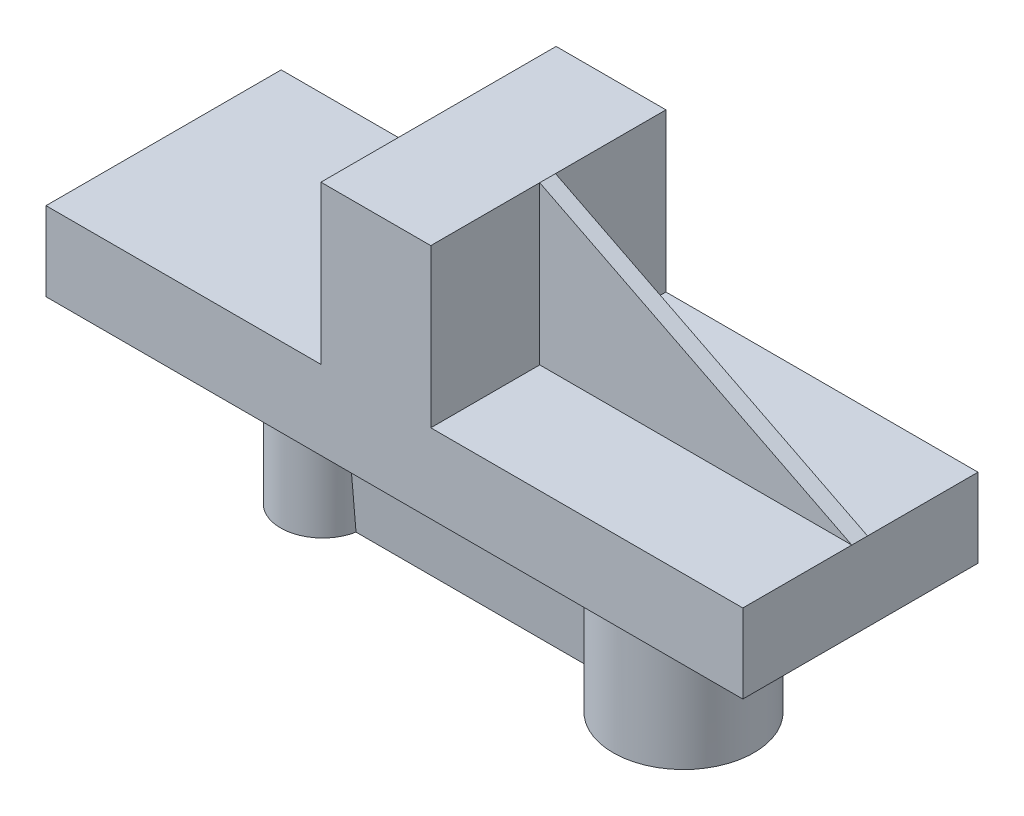
ISO-10303-21;
HEADER;
FILE_DESCRIPTION(('STEP AP214'),'2;1');
FILE_NAME('part.step','',(''),(''),'','','');
FILE_SCHEMA(('AUTOMOTIVE_DESIGN { 1 0 10303 214 1 1 1 1 }'));
ENDSEC;
DATA;
#1=APPLICATION_CONTEXT('core data for automotive mechanical design processes');
#2=APPLICATION_PROTOCOL_DEFINITION('international standard','automotive_design',2000,#1);
#3=PRODUCT_CONTEXT('',#1,'mechanical');
#4=PRODUCT('Part','Part','',(#3));
#5=PRODUCT_RELATED_PRODUCT_CATEGORY('part','',(#4));
#6=PRODUCT_DEFINITION_FORMATION('','',#4);
#7=PRODUCT_DEFINITION_CONTEXT('part definition',#1,'design');
#8=PRODUCT_DEFINITION('design','',#6,#7);
#9=PRODUCT_DEFINITION_SHAPE('','',#8);
#10=(LENGTH_UNIT() NAMED_UNIT(*) SI_UNIT(.MILLI.,.METRE.));
#11=(NAMED_UNIT(*) PLANE_ANGLE_UNIT() SI_UNIT($,.RADIAN.));
#12=(NAMED_UNIT(*) SI_UNIT($,.STERADIAN.) SOLID_ANGLE_UNIT());
#13=UNCERTAINTY_MEASURE_WITH_UNIT(LENGTH_MEASURE(1.E-05),#10,'distance_accuracy_value','');
#14=(GEOMETRIC_REPRESENTATION_CONTEXT(3) GLOBAL_UNCERTAINTY_ASSIGNED_CONTEXT((#13)) GLOBAL_UNIT_ASSIGNED_CONTEXT((#10,
#11,#12)) REPRESENTATION_CONTEXT('',''));
#15=CARTESIAN_POINT('',(0.,0.,0.));
#16=DIRECTION('',(0.,0.,1.));
#17=DIRECTION('',(1.,0.,0.));
#18=AXIS2_PLACEMENT_3D('',#15,#16,#17);
#19=CARTESIAN_POINT('',(0.,10.,0.));
#20=DIRECTION('',(0.,1.,0.));
#21=DIRECTION('',(0.,0.,1.));
#22=AXIS2_PLACEMENT_3D('',#19,#20,#21);
#23=PLANE('',#22);
#24=DIRECTION('',(0.,0.,-1.));
#25=VECTOR('',#24,1.);
#26=CARTESIAN_POINT('',(88.3232628691615,10.,0.));
#27=LINE('',#26,#25);
#28=CARTESIAN_POINT('',(88.3232628691615,10.,14.));
#29=VERTEX_POINT('',#28);
#30=CARTESIAN_POINT('',(88.3232628691615,10.,0.));
#31=VERTEX_POINT('',#30);
#32=EDGE_CURVE('E225',#29,#31,#27,.T.);
#33=ORIENTED_EDGE('',*,*,#32,.T.);
#34=DIRECTION('',(-1.,0.,0.));
#35=VECTOR('',#34,1.);
#36=CARTESIAN_POINT('',(0.,10.,0.));
#37=LINE('',#36,#35);
#38=CARTESIAN_POINT('',(48.7716091547332,10.,0.));
#39=VERTEX_POINT('',#38);
#40=EDGE_CURVE('E229',#31,#39,#37,.T.);
#41=ORIENTED_EDGE('',*,*,#40,.T.);
#42=DIRECTION('',(0.,0.,-1.));
#43=VECTOR('',#42,1.);
#44=CARTESIAN_POINT('',(48.7716091547332,10.,0.));
#45=LINE('',#44,#43);
#46=CARTESIAN_POINT('',(48.7716091547332,10.,14.));
#47=VERTEX_POINT('',#46);
#48=EDGE_CURVE('E204',#47,#39,#45,.T.);
#49=ORIENTED_EDGE('',*,*,#48,.F.);
#50=DIRECTION('',(1.,0.,0.));
#51=VECTOR('',#50,1.);
#52=CARTESIAN_POINT('',(0.,10.,14.));
#53=LINE('',#52,#51);
#54=EDGE_CURVE('E179',#47,#29,#53,.T.);
#55=ORIENTED_EDGE('',*,*,#54,.T.);
#56=EDGE_LOOP('',(#33,#41,#49,#55));
#57=FACE_BOUND('',#56,.T.);
#58=ADVANCED_FACE('F33',(#57),#23,.T.);
#59=CARTESIAN_POINT('',(48.7716091547332,30.,0.));
#60=DIRECTION('',(-1.,0.,0.));
#61=DIRECTION('',(0.,0.,1.));
#62=AXIS2_PLACEMENT_3D('',#59,#60,#61);
#63=PLANE('',#62);
#64=ORIENTED_EDGE('',*,*,#48,.T.);
#65=DIRECTION('',(0.,-1.,0.));
#66=VECTOR('',#65,1.);
#67=CARTESIAN_POINT('',(48.7716091547332,30.,0.));
#68=LINE('',#67,#66);
#69=CARTESIAN_POINT('',(48.7716091547332,30.,0.));
#70=VERTEX_POINT('',#69);
#71=EDGE_CURVE('E208',#70,#39,#68,.T.);
#72=ORIENTED_EDGE('',*,*,#71,.F.);
#73=DIRECTION('',(0.,0.,-1.));
#74=VECTOR('',#73,1.);
#75=CARTESIAN_POINT('',(48.7716091547332,30.,0.));
#76=LINE('',#75,#74);
#77=CARTESIAN_POINT('',(48.7716091547332,30.,14.));
#78=VERTEX_POINT('',#77);
#79=EDGE_CURVE('E196',#78,#70,#76,.T.);
#80=ORIENTED_EDGE('',*,*,#79,.F.);
#81=DIRECTION('',(0.,1.,0.));
#82=VECTOR('',#81,1.);
#83=CARTESIAN_POINT('',(48.7716091547332,30.,14.));
#84=LINE('',#83,#82);
#85=EDGE_CURVE('E176',#47,#78,#84,.T.);
#86=ORIENTED_EDGE('',*,*,#85,.F.);
#87=EDGE_LOOP('',(#64,#72,#80,#86));
#88=FACE_BOUND('',#87,.T.);
#89=ADVANCED_FACE('F284',(#88),#63,.F.);
#90=DIRECTION('',(1.,0.,0.));
#91=VECTOR('',#90,1.);
#92=CARTESIAN_POINT('',(0.,10.,29.809101218342));
#93=LINE('',#92,#91);
#94=CARTESIAN_POINT('',(0.,10.,29.809101218342));
#95=VERTEX_POINT('',#94);
#96=CARTESIAN_POINT('',(34.8475948163136,10.,29.809101218342));
#97=VERTEX_POINT('',#96);
#98=EDGE_CURVE('E222',#95,#97,#93,.T.);
#99=ORIENTED_EDGE('',*,*,#98,.T.);
#100=DIRECTION('',(0.,0.,1.));
#101=VECTOR('',#100,1.);
#102=CARTESIAN_POINT('',(34.8475948163136,10.,0.));
#103=LINE('',#102,#101);
#104=CARTESIAN_POINT('',(34.8475948163136,10.,0.));
#105=VERTEX_POINT('',#104);
#106=EDGE_CURVE('E190',#105,#97,#103,.T.);
#107=ORIENTED_EDGE('',*,*,#106,.F.);
#108=CARTESIAN_POINT('',(0.,10.,0.));
#109=VERTEX_POINT('',#108);
#110=EDGE_CURVE('E228',#105,#109,#37,.T.);
#111=ORIENTED_EDGE('',*,*,#110,.T.);
#112=DIRECTION('',(0.,0.,1.));
#113=VECTOR('',#112,1.);
#114=CARTESIAN_POINT('',(0.,10.,0.));
#115=LINE('',#114,#113);
#116=EDGE_CURVE('E218',#109,#95,#115,.T.);
#117=ORIENTED_EDGE('',*,*,#116,.T.);
#118=EDGE_LOOP('',(#99,#107,#111,#117));
#119=FACE_BOUND('',#118,.T.);
#120=ADVANCED_FACE('F306',(#119),#23,.T.);
#121=CARTESIAN_POINT('',(0.,10.,0.));
#122=DIRECTION('',(1.,0.,0.));
#123=DIRECTION('',(0.,0.,-1.));
#124=AXIS2_PLACEMENT_3D('',#121,#122,#123);
#125=PLANE('',#124);
#126=DIRECTION('',(0.,-1.,0.));
#127=VECTOR('',#126,1.);
#128=CARTESIAN_POINT('',(0.,10.,29.809101218342));
#129=LINE('',#128,#127);
#130=CARTESIAN_POINT('',(0.,0.,29.809101218342));
#131=VERTEX_POINT('',#130);
#132=EDGE_CURVE('E247',#95,#131,#129,.T.);
#133=ORIENTED_EDGE('',*,*,#132,.F.);
#134=ORIENTED_EDGE('',*,*,#116,.F.);
#135=DIRECTION('',(0.,-1.,0.));
#136=VECTOR('',#135,1.);
#137=CARTESIAN_POINT('',(0.,10.,0.));
#138=LINE('',#137,#136);
#139=CARTESIAN_POINT('',(0.,0.,0.));
#140=VERTEX_POINT('',#139);
#141=EDGE_CURVE('E232',#109,#140,#138,.T.);
#142=ORIENTED_EDGE('',*,*,#141,.T.);
#143=DIRECTION('',(0.,0.,1.));
#144=VECTOR('',#143,1.);
#145=CARTESIAN_POINT('',(0.,0.,0.));
#146=LINE('',#145,#144);
#147=EDGE_CURVE('E217',#140,#131,#146,.T.);
#148=ORIENTED_EDGE('',*,*,#147,.T.);
#149=EDGE_LOOP('',(#133,#134,#142,#148));
#150=FACE_BOUND('',#149,.T.);
#151=ADVANCED_FACE('F35',(#150),#125,.F.);
#152=CARTESIAN_POINT('',(0.,10.,29.809101218342));
#153=DIRECTION('',(0.,0.,-1.));
#154=DIRECTION('',(-1.,0.,0.));
#155=AXIS2_PLACEMENT_3D('',#152,#153,#154);
#156=PLANE('',#155);
#157=DIRECTION('',(1.,0.,0.));
#158=VECTOR('',#157,1.);
#159=CARTESIAN_POINT('',(0.,0.,29.809101218342));
#160=LINE('',#159,#158);
#161=CARTESIAN_POINT('',(88.3232628691615,0.,29.809101218342));
#162=VERTEX_POINT('',#161);
#163=EDGE_CURVE('E234',#131,#162,#160,.T.);
#164=ORIENTED_EDGE('',*,*,#163,.T.);
#165=DIRECTION('',(0.,-1.,0.));
#166=VECTOR('',#165,1.);
#167=CARTESIAN_POINT('',(88.3232628691615,10.,29.809101218342));
#168=LINE('',#167,#166);
#169=CARTESIAN_POINT('',(88.3232628691615,10.,29.809101218342));
#170=VERTEX_POINT('',#169);
#171=EDGE_CURVE('E244',#170,#162,#168,.T.);
#172=ORIENTED_EDGE('',*,*,#171,.F.);
#173=CARTESIAN_POINT('',(48.7716091547332,10.,29.809101218342));
#174=VERTEX_POINT('',#173);
#175=EDGE_CURVE('E220',#174,#170,#93,.T.);
#176=ORIENTED_EDGE('',*,*,#175,.F.);
#177=DIRECTION('',(0.,-1.,0.));
#178=VECTOR('',#177,1.);
#179=CARTESIAN_POINT('',(48.7716091547332,30.,29.809101218342));
#180=LINE('',#179,#178);
#181=CARTESIAN_POINT('',(48.7716091547332,30.,29.809101218342));
#182=VERTEX_POINT('',#181);
#183=EDGE_CURVE('E211',#182,#174,#180,.T.);
#184=ORIENTED_EDGE('',*,*,#183,.F.);
#185=DIRECTION('',(1.,0.,0.));
#186=VECTOR('',#185,1.);
#187=CARTESIAN_POINT('',(34.8475948163136,30.,29.809101218342));
#188=LINE('',#187,#186);
#189=CARTESIAN_POINT('',(34.8475948163136,30.,29.809101218342));
#190=VERTEX_POINT('',#189);
#191=EDGE_CURVE('E193',#190,#182,#188,.T.);
#192=ORIENTED_EDGE('',*,*,#191,.F.);
#193=DIRECTION('',(0.,-1.,0.));
#194=VECTOR('',#193,1.);
#195=CARTESIAN_POINT('',(34.8475948163136,30.,29.809101218342));
#196=LINE('',#195,#194);
#197=EDGE_CURVE('E214',#190,#97,#196,.T.);
#198=ORIENTED_EDGE('',*,*,#197,.T.);
#199=ORIENTED_EDGE('',*,*,#98,.F.);
#200=ORIENTED_EDGE('',*,*,#132,.T.);
#201=EDGE_LOOP('',(#164,#172,#176,#184,#192,#198,#199,#200));
#202=FACE_BOUND('',#201,.T.);
#203=ADVANCED_FACE('F252',(#202),#156,.F.);
#204=CARTESIAN_POINT('',(88.3232628691615,10.,0.));
#205=DIRECTION('',(-1.,0.,0.));
#206=DIRECTION('',(0.,0.,1.));
#207=AXIS2_PLACEMENT_3D('',#204,#205,#206);
#208=PLANE('',#207);
#209=DIRECTION('',(0.,0.,-1.));
#210=VECTOR('',#209,1.);
#211=CARTESIAN_POINT('',(88.3232628691615,0.,0.));
#212=LINE('',#211,#210);
#213=CARTESIAN_POINT('',(88.3232628691615,0.,0.));
#214=VERTEX_POINT('',#213);
#215=EDGE_CURVE('E236',#162,#214,#212,.T.);
#216=ORIENTED_EDGE('',*,*,#215,.T.);
#217=DIRECTION('',(0.,-1.,0.));
#218=VECTOR('',#217,1.);
#219=CARTESIAN_POINT('',(88.3232628691615,10.,0.));
#220=LINE('',#219,#218);
#221=EDGE_CURVE('E241',#31,#214,#220,.T.);
#222=ORIENTED_EDGE('',*,*,#221,.F.);
#223=ORIENTED_EDGE('',*,*,#32,.F.);
#224=DIRECTION('',(0.,0.,1.));
#225=VECTOR('',#224,1.);
#226=CARTESIAN_POINT('',(88.3232628691615,10.,0.));
#227=LINE('',#226,#225);
#228=CARTESIAN_POINT('',(88.3232628691615,10.,16.));
#229=VERTEX_POINT('',#228);
#230=EDGE_CURVE('E188',#229,#29,#227,.F.);
#231=ORIENTED_EDGE('',*,*,#230,.F.);
#232=EDGE_CURVE('E226',#170,#229,#27,.T.);
#233=ORIENTED_EDGE('',*,*,#232,.F.);
#234=ORIENTED_EDGE('',*,*,#171,.T.);
#235=EDGE_LOOP('',(#216,#222,#223,#231,#233,#234));
#236=FACE_BOUND('',#235,.T.);
#237=ADVANCED_FACE('F265',(#236),#208,.F.);
#238=CARTESIAN_POINT('',(0.,10.,0.));
#239=DIRECTION('',(0.,0.,1.));
#240=DIRECTION('',(1.,0.,0.));
#241=AXIS2_PLACEMENT_3D('',#238,#239,#240);
#242=PLANE('',#241);
#243=DIRECTION('',(-1.,0.,0.));
#244=VECTOR('',#243,1.);
#245=CARTESIAN_POINT('',(0.,0.,0.));
#246=LINE('',#245,#244);
#247=EDGE_CURVE('E221',#214,#140,#246,.T.);
#248=ORIENTED_EDGE('',*,*,#247,.T.);
#249=ORIENTED_EDGE('',*,*,#141,.F.);
#250=ORIENTED_EDGE('',*,*,#110,.F.);
#251=DIRECTION('',(0.,-1.,0.));
#252=VECTOR('',#251,1.);
#253=CARTESIAN_POINT('',(34.8475948163136,30.,0.));
#254=LINE('',#253,#252);
#255=CARTESIAN_POINT('',(34.8475948163136,30.,0.));
#256=VERTEX_POINT('',#255);
#257=EDGE_CURVE('E202',#256,#105,#254,.T.);
#258=ORIENTED_EDGE('',*,*,#257,.F.);
#259=DIRECTION('',(-1.,0.,0.));
#260=VECTOR('',#259,1.);
#261=CARTESIAN_POINT('',(34.8475948163136,30.,0.));
#262=LINE('',#261,#260);
#263=EDGE_CURVE('E199',#70,#256,#262,.T.);
#264=ORIENTED_EDGE('',*,*,#263,.F.);
#265=ORIENTED_EDGE('',*,*,#71,.T.);
#266=ORIENTED_EDGE('',*,*,#40,.F.);
#267=ORIENTED_EDGE('',*,*,#221,.T.);
#268=EDGE_LOOP('',(#248,#249,#250,#258,#264,#265,#266,#267));
#269=FACE_BOUND('',#268,.T.);
#270=ADVANCED_FACE('F270',(#269),#242,.F.);
#271=ORIENTED_EDGE('',*,*,#232,.T.);
#272=DIRECTION('',(1.,0.,0.));
#273=VECTOR('',#272,1.);
#274=CARTESIAN_POINT('',(0.,10.,16.));
#275=LINE('',#274,#273);
#276=CARTESIAN_POINT('',(48.7716091547332,10.,16.));
#277=VERTEX_POINT('',#276);
#278=EDGE_CURVE('E185',#277,#229,#275,.T.);
#279=ORIENTED_EDGE('',*,*,#278,.F.);
#280=EDGE_CURVE('E194',#174,#277,#45,.T.);
#281=ORIENTED_EDGE('',*,*,#280,.F.);
#282=ORIENTED_EDGE('',*,*,#175,.T.);
#283=EDGE_LOOP('',(#271,#279,#281,#282));
#284=FACE_BOUND('',#283,.T.);
#285=ADVANCED_FACE('F297',(#284),#23,.T.);
#286=CARTESIAN_POINT('',(0.,0.,0.));
#287=DIRECTION('',(0.,1.,0.));
#288=DIRECTION('',(0.,0.,1.));
#289=AXIS2_PLACEMENT_3D('',#286,#287,#288);
#290=PLANE('',#289);
#291=CARTESIAN_POINT('',(20.2556041143617,0.,15.));
#292=DIRECTION('',(0.,1.,0.));
#293=DIRECTION('',(0.,0.,1.));
#294=AXIS2_PLACEMENT_3D('',#291,#292,#293);
#295=CIRCLE('',#294,5.32677589371184);
#296=CARTESIAN_POINT('',(25.0118174540529,0.,17.3985362388702));
#297=VERTEX_POINT('',#296);
#298=CARTESIAN_POINT('',(25.0118174540529,0.,12.6014637611298));
#299=VERTEX_POINT('',#298);
#300=EDGE_CURVE('E41',#297,#299,#295,.F.);
#301=ORIENTED_EDGE('',*,*,#300,.F.);
#302=DIRECTION('',(1.,0.,0.));
#303=VECTOR('',#302,1.);
#304=CARTESIAN_POINT('',(0.,0.,17.3985362388702));
#305=LINE('',#304,#303);
#306=CARTESIAN_POINT('',(57.3994055815291,0.,17.3985362388702));
#307=VERTEX_POINT('',#306);
#308=EDGE_CURVE('E163',#297,#307,#305,.T.);
#309=ORIENTED_EDGE('',*,*,#308,.T.);
#310=CARTESIAN_POINT('',(65.9978728396293,0.,15.));
#311=DIRECTION('',(0.,1.,0.));
#312=DIRECTION('',(0.,0.,1.));
#313=AXIS2_PLACEMENT_3D('',#310,#311,#312);
#314=CIRCLE('',#313,8.92673598118572);
#315=CARTESIAN_POINT('',(57.3994055815291,0.,12.6014637611298));
#316=VERTEX_POINT('',#315);
#317=EDGE_CURVE('E11',#316,#307,#314,.F.);
#318=ORIENTED_EDGE('',*,*,#317,.F.);
#319=DIRECTION('',(1.,0.,0.));
#320=VECTOR('',#319,1.);
#321=CARTESIAN_POINT('',(0.,0.,12.6014637611298));
#322=LINE('',#321,#320);
#323=EDGE_CURVE('E161',#299,#316,#322,.T.);
#324=ORIENTED_EDGE('',*,*,#323,.F.);
#325=EDGE_LOOP('',(#301,#309,#318,#324));
#326=FACE_BOUND('',#325,.T.);
#327=ORIENTED_EDGE('',*,*,#163,.F.);
#328=ORIENTED_EDGE('',*,*,#147,.F.);
#329=ORIENTED_EDGE('',*,*,#247,.F.);
#330=ORIENTED_EDGE('',*,*,#215,.F.);
#331=EDGE_LOOP('',(#327,#328,#329,#330));
#332=FACE_BOUND('',#331,.T.);
#333=ADVANCED_FACE('F262',(#326,#332),#290,.F.);
#334=CARTESIAN_POINT('',(34.8475948163136,30.,0.));
#335=DIRECTION('',(1.,0.,0.));
#336=DIRECTION('',(0.,0.,-1.));
#337=AXIS2_PLACEMENT_3D('',#334,#335,#336);
#338=PLANE('',#337);
#339=ORIENTED_EDGE('',*,*,#197,.F.);
#340=DIRECTION('',(0.,0.,1.));
#341=VECTOR('',#340,1.);
#342=CARTESIAN_POINT('',(34.8475948163136,30.,0.));
#343=LINE('',#342,#341);
#344=EDGE_CURVE('E191',#256,#190,#343,.T.);
#345=ORIENTED_EDGE('',*,*,#344,.F.);
#346=ORIENTED_EDGE('',*,*,#257,.T.);
#347=ORIENTED_EDGE('',*,*,#106,.T.);
#348=EDGE_LOOP('',(#339,#345,#346,#347));
#349=FACE_BOUND('',#348,.T.);
#350=ADVANCED_FACE('F302',(#349),#338,.F.);
#351=ORIENTED_EDGE('',*,*,#280,.T.);
#352=DIRECTION('',(0.,1.,0.));
#353=VECTOR('',#352,1.);
#354=CARTESIAN_POINT('',(48.7716091547332,30.,16.));
#355=LINE('',#354,#353);
#356=CARTESIAN_POINT('',(48.7716091547332,30.,16.));
#357=VERTEX_POINT('',#356);
#358=EDGE_CURVE('E182',#277,#357,#355,.T.);
#359=ORIENTED_EDGE('',*,*,#358,.T.);
#360=EDGE_CURVE('E197',#182,#357,#76,.T.);
#361=ORIENTED_EDGE('',*,*,#360,.F.);
#362=ORIENTED_EDGE('',*,*,#183,.T.);
#363=EDGE_LOOP('',(#351,#359,#361,#362));
#364=FACE_BOUND('',#363,.T.);
#365=ADVANCED_FACE('F293',(#364),#63,.F.);
#366=CARTESIAN_POINT('',(0.,30.,0.));
#367=DIRECTION('',(0.,1.,0.));
#368=DIRECTION('',(0.,0.,1.));
#369=AXIS2_PLACEMENT_3D('',#366,#367,#368);
#370=PLANE('',#369);
#371=ORIENTED_EDGE('',*,*,#360,.T.);
#372=EDGE_CURVE('E200',#357,#78,#76,.T.);
#373=ORIENTED_EDGE('',*,*,#372,.T.);
#374=ORIENTED_EDGE('',*,*,#79,.T.);
#375=ORIENTED_EDGE('',*,*,#263,.T.);
#376=ORIENTED_EDGE('',*,*,#344,.T.);
#377=ORIENTED_EDGE('',*,*,#191,.T.);
#378=EDGE_LOOP('',(#371,#373,#374,#375,#376,#377));
#379=FACE_BOUND('',#378,.T.);
#380=ADVANCED_FACE('F286',(#379),#370,.T.);
#381=CARTESIAN_POINT('',(48.7716091547332,30.,15.));
#382=DIRECTION('',(-0.451255392627594,-0.892394851298749,0.));
#383=DIRECTION('',(0.892394851298749,-0.451255392627594,0.));
#384=AXIS2_PLACEMENT_3D('',#381,#382,#383);
#385=PLANE('',#384);
#386=DIRECTION('',(0.892394851298749,-0.451255392627594,0.));
#387=VECTOR('',#386,1.);
#388=CARTESIAN_POINT('',(48.7716091547332,30.,16.));
#389=LINE('',#388,#387);
#390=EDGE_CURVE('E173',#357,#229,#389,.T.);
#391=ORIENTED_EDGE('',*,*,#390,.T.);
#392=ORIENTED_EDGE('',*,*,#230,.T.);
#393=DIRECTION('',(0.892394851298749,-0.451255392627594,0.));
#394=VECTOR('',#393,1.);
#395=CARTESIAN_POINT('',(48.7716091547332,30.,14.));
#396=LINE('',#395,#394);
#397=EDGE_CURVE('E56',#78,#29,#396,.T.);
#398=ORIENTED_EDGE('',*,*,#397,.F.);
#399=ORIENTED_EDGE('',*,*,#372,.F.);
#400=EDGE_LOOP('',(#391,#392,#398,#399));
#401=FACE_BOUND('',#400,.T.);
#402=ADVANCED_FACE('F276',(#401),#385,.F.);
#403=CARTESIAN_POINT('',(44.1616314345808,15.,16.));
#404=DIRECTION('',(0.,0.,1.));
#405=DIRECTION('',(1.,0.,0.));
#406=AXIS2_PLACEMENT_3D('',#403,#404,#405);
#407=PLANE('',#406);
#408=ORIENTED_EDGE('',*,*,#358,.F.);
#409=ORIENTED_EDGE('',*,*,#278,.T.);
#410=ORIENTED_EDGE('',*,*,#390,.F.);
#411=EDGE_LOOP('',(#408,#409,#410));
#412=FACE_BOUND('',#411,.T.);
#413=ADVANCED_FACE('F290',(#412),#407,.T.);
#414=CARTESIAN_POINT('',(44.1616314345808,15.,14.));
#415=DIRECTION('',(0.,0.,1.));
#416=DIRECTION('',(1.,0.,0.));
#417=AXIS2_PLACEMENT_3D('',#414,#415,#416);
#418=PLANE('',#417);
#419=ORIENTED_EDGE('',*,*,#54,.F.);
#420=ORIENTED_EDGE('',*,*,#85,.T.);
#421=ORIENTED_EDGE('',*,*,#397,.T.);
#422=EDGE_LOOP('',(#419,#420,#421));
#423=FACE_BOUND('',#422,.T.);
#424=ADVANCED_FACE('F279',(#423),#418,.F.);
#425=CARTESIAN_POINT('',(20.2556041143617,-20.,15.));
#426=DIRECTION('',(0.,1.,0.));
#427=DIRECTION('',(0.,0.,1.));
#428=AXIS2_PLACEMENT_3D('',#425,#426,#427);
#429=CYLINDRICAL_SURFACE('',#428,5.32677589371184);
#430=CARTESIAN_POINT('',(20.2556041143617,-34.3006662567119,15.));
#431=DIRECTION('',(0.,-0.0697564737441253,0.997564050259824));
#432=DIRECTION('',(0.,0.997564050259824,0.0697564737441254));
#433=AXIS2_PLACEMENT_3D('',#430,#431,#432);
#434=ELLIPSE('',#433,76.3624593933899,5.32677589371184);
#435=CARTESIAN_POINT('',(25.4876726748672,-20.,16.));
#436=VERTEX_POINT('',#435);
#437=EDGE_CURVE('E170',#436,#297,#434,.T.);
#438=ORIENTED_EDGE('',*,*,#437,.T.);
#439=ORIENTED_EDGE('',*,*,#300,.T.);
#440=CARTESIAN_POINT('',(20.2556041143617,-34.3006662567119,15.));
#441=DIRECTION('',(0.,0.0697564737441253,0.997564050259824));
#442=DIRECTION('',(0.,0.997564050259824,-0.0697564737441254));
#443=AXIS2_PLACEMENT_3D('',#440,#441,#442);
#444=ELLIPSE('',#443,76.3624593933899,5.32677589371184);
#445=CARTESIAN_POINT('',(25.4876726748672,-20.,14.));
#446=VERTEX_POINT('',#445);
#447=EDGE_CURVE('E155',#446,#299,#444,.T.);
#448=ORIENTED_EDGE('',*,*,#447,.F.);
#449=CARTESIAN_POINT('',(20.2556041143617,-20.,15.));
#450=DIRECTION('',(0.,-1.,0.));
#451=DIRECTION('',(0.,0.,-1.));
#452=AXIS2_PLACEMENT_3D('',#449,#450,#451);
#453=CIRCLE('',#452,5.32677589371184);
#454=EDGE_CURVE('E141',#436,#446,#453,.T.);
#455=ORIENTED_EDGE('',*,*,#454,.F.);
#456=EDGE_LOOP('',(#438,#439,#448,#455));
#457=FACE_BOUND('',#456,.T.);
#458=ADVANCED_FACE('F159',(#457),#429,.T.);
#459=CARTESIAN_POINT('',(20.2556041143617,-20.,15.));
#460=DIRECTION('',(0.,-1.,0.));
#461=DIRECTION('',(0.,0.,-1.));
#462=AXIS2_PLACEMENT_3D('',#459,#460,#461);
#463=PLANE('',#462);
#464=ORIENTED_EDGE('',*,*,#454,.T.);
#465=DIRECTION('',(-1.,0.,0.));
#466=VECTOR('',#465,1.);
#467=CARTESIAN_POINT('',(25.5823800080736,-20.,14.));
#468=LINE('',#467,#466);
#469=CARTESIAN_POINT('',(57.1273252084063,-20.,14.));
#470=VERTEX_POINT('',#469);
#471=EDGE_CURVE('E144',#446,#470,#468,.F.);
#472=ORIENTED_EDGE('',*,*,#471,.T.);
#473=CARTESIAN_POINT('',(65.9978728396293,-20.,15.));
#474=DIRECTION('',(0.,-1.,0.));
#475=DIRECTION('',(0.,0.,-1.));
#476=AXIS2_PLACEMENT_3D('',#473,#474,#475);
#477=CIRCLE('',#476,8.92673598118572);
#478=CARTESIAN_POINT('',(57.1273252084063,-20.,16.));
#479=VERTEX_POINT('',#478);
#480=EDGE_CURVE('E48',#470,#479,#477,.T.);
#481=ORIENTED_EDGE('',*,*,#480,.T.);
#482=DIRECTION('',(1.,0.,0.));
#483=VECTOR('',#482,1.);
#484=CARTESIAN_POINT('',(44.1616314345808,-20.,16.));
#485=LINE('',#484,#483);
#486=EDGE_CURVE('E147',#436,#479,#485,.T.);
#487=ORIENTED_EDGE('',*,*,#486,.F.);
#488=EDGE_LOOP('',(#464,#472,#481,#487));
#489=FACE_BOUND('',#488,.T.);
#490=ADVANCED_FACE('F143',(#489),#463,.T.);
#491=CARTESIAN_POINT('',(65.9978728396293,-20.,15.));
#492=DIRECTION('',(0.,1.,0.));
#493=DIRECTION('',(0.,0.,1.));
#494=AXIS2_PLACEMENT_3D('',#491,#492,#493);
#495=CYLINDRICAL_SURFACE('',#494,8.92673598118572);
#496=ORIENTED_EDGE('',*,*,#317,.T.);
#497=CARTESIAN_POINT('',(65.9978728396293,-34.3006662567119,15.));
#498=DIRECTION('',(0.,-0.0697564737441253,0.997564050259824));
#499=DIRECTION('',(0.,0.997564050259824,0.0697564737441254));
#500=AXIS2_PLACEMENT_3D('',#497,#498,#499);
#501=ELLIPSE('',#500,127.970000518231,8.92673598118572);
#502=EDGE_CURVE('E160',#307,#479,#501,.T.);
#503=ORIENTED_EDGE('',*,*,#502,.T.);
#504=ORIENTED_EDGE('',*,*,#480,.F.);
#505=CARTESIAN_POINT('',(65.9978728396293,-34.3006662567119,15.));
#506=DIRECTION('',(0.,0.0697564737441253,0.997564050259824));
#507=DIRECTION('',(0.,0.997564050259824,-0.0697564737441254));
#508=AXIS2_PLACEMENT_3D('',#505,#506,#507);
#509=ELLIPSE('',#508,127.970000518231,8.92673598118572);
#510=EDGE_CURVE('E157',#316,#470,#509,.T.);
#511=ORIENTED_EDGE('',*,*,#510,.F.);
#512=EDGE_LOOP('',(#496,#503,#504,#511));
#513=FACE_BOUND('',#512,.T.);
#514=ADVANCED_FACE('F406',(#513),#495,.T.);
#515=CARTESIAN_POINT('',(44.1616314345808,-20.,16.));
#516=DIRECTION('',(0.,-0.0697564737441253,0.997564050259824));
#517=DIRECTION('',(0.,-0.997564050259824,-0.0697564737441254));
#518=AXIS2_PLACEMENT_3D('',#515,#516,#517);
#519=PLANE('',#518);
#520=ORIENTED_EDGE('',*,*,#437,.F.);
#521=ORIENTED_EDGE('',*,*,#486,.T.);
#522=ORIENTED_EDGE('',*,*,#502,.F.);
#523=ORIENTED_EDGE('',*,*,#308,.F.);
#524=EDGE_LOOP('',(#520,#521,#522,#523));
#525=FACE_BOUND('',#524,.T.);
#526=ADVANCED_FACE('F417',(#525),#519,.T.);
#527=CARTESIAN_POINT('',(44.1616314345808,-20.,14.));
#528=DIRECTION('',(0.,0.0697564737441253,0.997564050259824));
#529=DIRECTION('',(0.,-0.997564050259824,0.0697564737441254));
#530=AXIS2_PLACEMENT_3D('',#527,#528,#529);
#531=PLANE('',#530);
#532=ORIENTED_EDGE('',*,*,#471,.F.);
#533=ORIENTED_EDGE('',*,*,#447,.T.);
#534=ORIENTED_EDGE('',*,*,#323,.T.);
#535=ORIENTED_EDGE('',*,*,#510,.T.);
#536=EDGE_LOOP('',(#532,#533,#534,#535));
#537=FACE_BOUND('',#536,.T.);
#538=ADVANCED_FACE('F154',(#537),#531,.F.);
#539=CLOSED_SHELL('',(#58,#89,#120,#151,#203,#237,#270,#285,#333,#350,#365,#380,#402,#413,#424,
#458,#490,#514,#526,#538));
#540=MANIFOLD_SOLID_BREP('B2',#539);
#541=ADVANCED_BREP_SHAPE_REPRESENTATION('',(#18,#540),#14);
#542=SHAPE_DEFINITION_REPRESENTATION(#9,#541);
ENDSEC;
END-ISO-10303-21;
